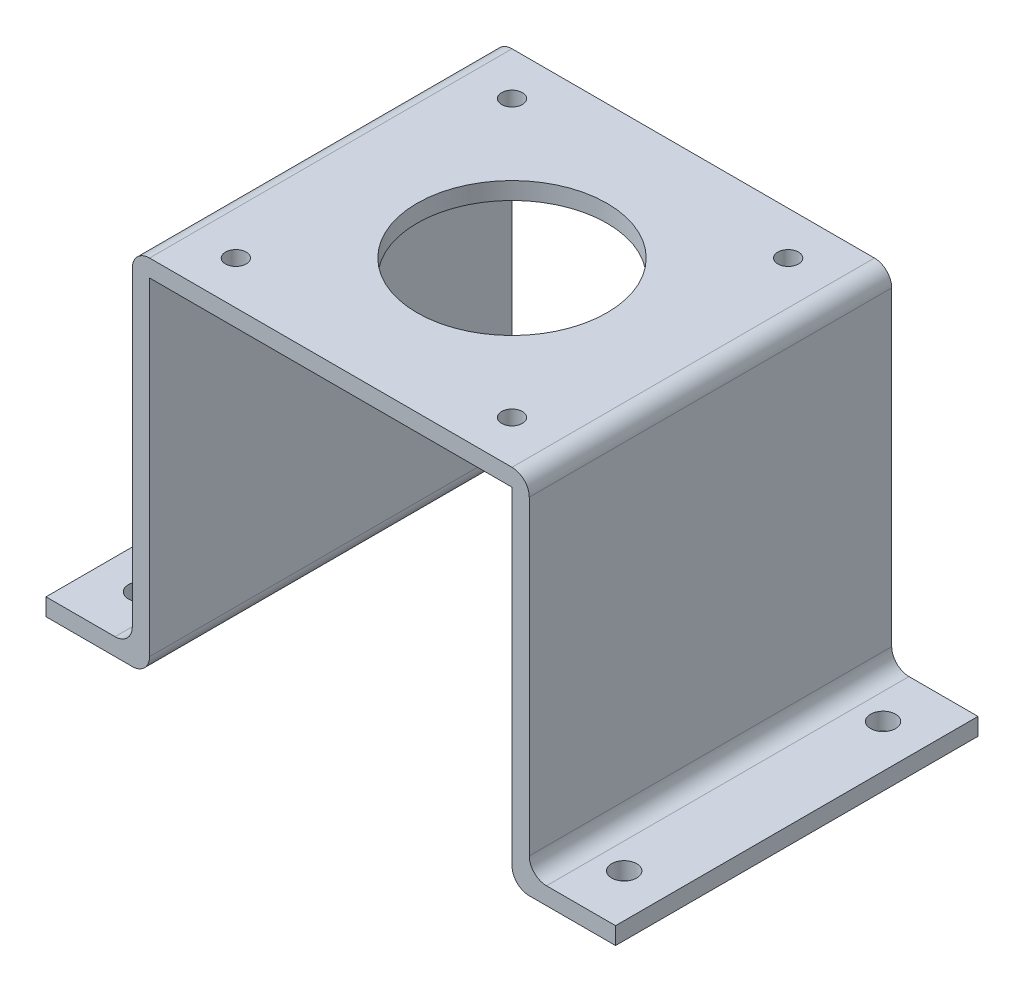
ISO-10303-21;
HEADER;
FILE_DESCRIPTION(('STEP AP214'),'2;1');
FILE_NAME('part.step','',(''),(''),'','','');
FILE_SCHEMA(('AUTOMOTIVE_DESIGN { 1 0 10303 214 1 1 1 1 }'));
ENDSEC;
DATA;
#1=APPLICATION_CONTEXT('core data for automotive mechanical design processes');
#2=APPLICATION_PROTOCOL_DEFINITION('international standard','automotive_design',2000,#1);
#3=PRODUCT_CONTEXT('',#1,'mechanical');
#4=PRODUCT('Part','Part','',(#3));
#5=PRODUCT_RELATED_PRODUCT_CATEGORY('part','',(#4));
#6=PRODUCT_DEFINITION_FORMATION('','',#4);
#7=PRODUCT_DEFINITION_CONTEXT('part definition',#1,'design');
#8=PRODUCT_DEFINITION('design','',#6,#7);
#9=PRODUCT_DEFINITION_SHAPE('','',#8);
#10=(LENGTH_UNIT() NAMED_UNIT(*) SI_UNIT(.MILLI.,.METRE.));
#11=(NAMED_UNIT(*) PLANE_ANGLE_UNIT() SI_UNIT($,.RADIAN.));
#12=(NAMED_UNIT(*) SI_UNIT($,.STERADIAN.) SOLID_ANGLE_UNIT());
#13=UNCERTAINTY_MEASURE_WITH_UNIT(LENGTH_MEASURE(1.E-05),#10,'distance_accuracy_value','');
#14=(GEOMETRIC_REPRESENTATION_CONTEXT(3) GLOBAL_UNCERTAINTY_ASSIGNED_CONTEXT((#13)) GLOBAL_UNIT_ASSIGNED_CONTEXT((#10,
#11,#12)) REPRESENTATION_CONTEXT('',''));
#15=CARTESIAN_POINT('',(0.,0.,0.));
#16=DIRECTION('',(0.,0.,1.));
#17=DIRECTION('',(1.,0.,0.));
#18=AXIS2_PLACEMENT_3D('',#15,#16,#17);
#19=CARTESIAN_POINT('',(66.,2.,42.));
#20=DIRECTION('',(0.,-1.,0.));
#21=DIRECTION('',(1.,0.,0.));
#22=AXIS2_PLACEMENT_3D('',#19,#20,#21);
#23=PLANE('',#22);
#24=CARTESIAN_POINT('',(61.,2.00000000000001,36.));
#25=DIRECTION('',(0.,1.,0.));
#26=DIRECTION('',(0.,0.,1.));
#27=AXIS2_PLACEMENT_3D('',#24,#25,#26);
#28=CIRCLE('',#27,1.45);
#29=CARTESIAN_POINT('',(61.,2.00000000000001,37.45));
#30=VERTEX_POINT('',#29);
#31=EDGE_CURVE('E489',#30,#30,#28,.T.);
#32=ORIENTED_EDGE('',*,*,#31,.F.);
#33=EDGE_LOOP('',(#32));
#34=FACE_BOUND('',#33,.T.);
#35=DIRECTION('',(-1.,0.,0.));
#36=VECTOR('',#35,1.);
#37=CARTESIAN_POINT('',(66.,2.,0.));
#38=LINE('',#37,#36);
#39=CARTESIAN_POINT('',(66.,2.,0.));
#40=VERTEX_POINT('',#39);
#41=CARTESIAN_POINT('',(58.,2.,0.));
#42=VERTEX_POINT('',#41);
#43=EDGE_CURVE('E284',#40,#42,#38,.T.);
#44=ORIENTED_EDGE('',*,*,#43,.T.);
#45=DIRECTION('',(0.,0.,-1.));
#46=VECTOR('',#45,1.);
#47=CARTESIAN_POINT('',(58.,2.,42.));
#48=LINE('',#47,#46);
#49=CARTESIAN_POINT('',(58.,2.,42.));
#50=VERTEX_POINT('',#49);
#51=EDGE_CURVE('E229',#42,#50,#48,.F.);
#52=ORIENTED_EDGE('',*,*,#51,.T.);
#53=DIRECTION('',(-1.,0.,0.));
#54=VECTOR('',#53,1.);
#55=CARTESIAN_POINT('',(66.,2.,42.));
#56=LINE('',#55,#54);
#57=CARTESIAN_POINT('',(66.,2.,42.));
#58=VERTEX_POINT('',#57);
#59=EDGE_CURVE('E323',#58,#50,#56,.T.);
#60=ORIENTED_EDGE('',*,*,#59,.F.);
#61=DIRECTION('',(0.,0.,-1.));
#62=VECTOR('',#61,1.);
#63=CARTESIAN_POINT('',(66.,2.,42.));
#64=LINE('',#63,#62);
#65=EDGE_CURVE('E263',#58,#40,#64,.T.);
#66=ORIENTED_EDGE('',*,*,#65,.T.);
#67=EDGE_LOOP('',(#44,#52,#60,#66));
#68=FACE_BOUND('',#67,.T.);
#69=CARTESIAN_POINT('',(61.,2.00000000000001,6.));
#70=DIRECTION('',(0.,1.,0.));
#71=DIRECTION('',(0.,0.,1.));
#72=AXIS2_PLACEMENT_3D('',#69,#70,#71);
#73=CIRCLE('',#72,1.45);
#74=CARTESIAN_POINT('',(61.,2.00000000000001,7.45));
#75=VERTEX_POINT('',#74);
#76=EDGE_CURVE('E483',#75,#75,#73,.T.);
#77=ORIENTED_EDGE('',*,*,#76,.F.);
#78=EDGE_LOOP('',(#77));
#79=FACE_BOUND('',#78,.T.);
#80=ADVANCED_FACE('F43',(#34,#68,#79),#23,.F.);
#81=CARTESIAN_POINT('',(0.,2.,42.));
#82=DIRECTION('',(1.,0.,0.));
#83=DIRECTION('',(0.,0.,-1.));
#84=AXIS2_PLACEMENT_3D('',#81,#82,#83);
#85=PLANE('',#84);
#86=DIRECTION('',(0.,-1.,0.));
#87=VECTOR('',#86,1.);
#88=CARTESIAN_POINT('',(0.,2.,0.));
#89=LINE('',#88,#87);
#90=CARTESIAN_POINT('',(0.,2.,0.));
#91=VERTEX_POINT('',#90);
#92=CARTESIAN_POINT('',(0.,0.,0.));
#93=VERTEX_POINT('',#92);
#94=EDGE_CURVE('E191',#91,#93,#89,.T.);
#95=ORIENTED_EDGE('',*,*,#94,.T.);
#96=DIRECTION('',(0.,0.,-1.));
#97=VECTOR('',#96,1.);
#98=CARTESIAN_POINT('',(0.,0.,42.));
#99=LINE('',#98,#97);
#100=CARTESIAN_POINT('',(0.,0.,42.));
#101=VERTEX_POINT('',#100);
#102=EDGE_CURVE('E173',#101,#93,#99,.T.);
#103=ORIENTED_EDGE('',*,*,#102,.F.);
#104=DIRECTION('',(0.,-1.,0.));
#105=VECTOR('',#104,1.);
#106=CARTESIAN_POINT('',(0.,2.,42.));
#107=LINE('',#106,#105);
#108=CARTESIAN_POINT('',(0.,2.,42.));
#109=VERTEX_POINT('',#108);
#110=EDGE_CURVE('E179',#109,#101,#107,.T.);
#111=ORIENTED_EDGE('',*,*,#110,.F.);
#112=DIRECTION('',(0.,0.,-1.));
#113=VECTOR('',#112,1.);
#114=CARTESIAN_POINT('',(0.,2.,42.));
#115=LINE('',#114,#113);
#116=EDGE_CURVE('E260',#109,#91,#115,.T.);
#117=ORIENTED_EDGE('',*,*,#116,.T.);
#118=EDGE_LOOP('',(#95,#103,#111,#117));
#119=FACE_BOUND('',#118,.T.);
#120=ADVANCED_FACE('F189',(#119),#85,.F.);
#121=CARTESIAN_POINT('',(0.,0.,42.));
#122=DIRECTION('',(0.,1.,0.));
#123=DIRECTION('',(0.,0.,1.));
#124=AXIS2_PLACEMENT_3D('',#121,#122,#123);
#125=PLANE('',#124);
#126=CARTESIAN_POINT('',(5.,0.,6.));
#127=DIRECTION('',(0.,1.,0.));
#128=DIRECTION('',(0.,0.,1.));
#129=AXIS2_PLACEMENT_3D('',#126,#127,#128);
#130=CIRCLE('',#129,1.45);
#131=CARTESIAN_POINT('',(5.,0.,7.45));
#132=VERTEX_POINT('',#131);
#133=EDGE_CURVE('E474',#132,#132,#130,.T.);
#134=ORIENTED_EDGE('',*,*,#133,.T.);
#135=EDGE_LOOP('',(#134));
#136=FACE_BOUND('',#135,.T.);
#137=CARTESIAN_POINT('',(5.,0.,36.));
#138=DIRECTION('',(0.,1.,0.));
#139=DIRECTION('',(0.,0.,1.));
#140=AXIS2_PLACEMENT_3D('',#137,#138,#139);
#141=CIRCLE('',#140,1.45);
#142=CARTESIAN_POINT('',(5.,0.,37.45));
#143=VERTEX_POINT('',#142);
#144=EDGE_CURVE('E480',#143,#143,#141,.T.);
#145=ORIENTED_EDGE('',*,*,#144,.T.);
#146=EDGE_LOOP('',(#145));
#147=FACE_BOUND('',#146,.T.);
#148=DIRECTION('',(1.,0.,0.));
#149=VECTOR('',#148,1.);
#150=CARTESIAN_POINT('',(0.,0.,0.));
#151=LINE('',#150,#149);
#152=CARTESIAN_POINT('',(10.,0.,0.));
#153=VERTEX_POINT('',#152);
#154=EDGE_CURVE('E270',#93,#153,#151,.T.);
#155=ORIENTED_EDGE('',*,*,#154,.T.);
#156=DIRECTION('',(0.,0.,-1.));
#157=VECTOR('',#156,1.);
#158=CARTESIAN_POINT('',(10.,0.,42.));
#159=LINE('',#158,#157);
#160=CARTESIAN_POINT('',(10.,0.,42.));
#161=VERTEX_POINT('',#160);
#162=EDGE_CURVE('E176',#153,#161,#159,.F.);
#163=ORIENTED_EDGE('',*,*,#162,.T.);
#164=DIRECTION('',(1.,0.,0.));
#165=VECTOR('',#164,1.);
#166=CARTESIAN_POINT('',(0.,0.,42.));
#167=LINE('',#166,#165);
#168=EDGE_CURVE('E168',#101,#161,#167,.T.);
#169=ORIENTED_EDGE('',*,*,#168,.F.);
#170=ORIENTED_EDGE('',*,*,#102,.T.);
#171=EDGE_LOOP('',(#155,#163,#169,#170));
#172=FACE_BOUND('',#171,.T.);
#173=ADVANCED_FACE('F171',(#136,#147,#172),#125,.F.);
#174=CARTESIAN_POINT('',(12.,0.,42.));
#175=DIRECTION('',(-1.,0.,0.));
#176=DIRECTION('',(0.,0.,1.));
#177=AXIS2_PLACEMENT_3D('',#174,#175,#176);
#178=PLANE('',#177);
#179=DIRECTION('',(0.,1.,0.));
#180=VECTOR('',#179,1.);
#181=CARTESIAN_POINT('',(12.,0.,42.));
#182=LINE('',#181,#180);
#183=CARTESIAN_POINT('',(12.,2.,42.));
#184=VERTEX_POINT('',#183);
#185=CARTESIAN_POINT('',(12.,40.,42.));
#186=VERTEX_POINT('',#185);
#187=EDGE_CURVE('E178',#184,#186,#182,.T.);
#188=ORIENTED_EDGE('',*,*,#187,.F.);
#189=DIRECTION('',(0.,0.,-1.));
#190=VECTOR('',#189,1.);
#191=CARTESIAN_POINT('',(12.,2.,42.));
#192=LINE('',#191,#190);
#193=CARTESIAN_POINT('',(12.,2.,0.));
#194=VERTEX_POINT('',#193);
#195=EDGE_CURVE('E192',#184,#194,#192,.T.);
#196=ORIENTED_EDGE('',*,*,#195,.T.);
#197=DIRECTION('',(0.,1.,0.));
#198=VECTOR('',#197,1.);
#199=CARTESIAN_POINT('',(12.,0.,0.));
#200=LINE('',#199,#198);
#201=CARTESIAN_POINT('',(12.,40.,0.));
#202=VERTEX_POINT('',#201);
#203=EDGE_CURVE('E273',#194,#202,#200,.T.);
#204=ORIENTED_EDGE('',*,*,#203,.T.);
#205=DIRECTION('',(0.,0.,-1.));
#206=VECTOR('',#205,1.);
#207=CARTESIAN_POINT('',(12.,40.,42.));
#208=LINE('',#207,#206);
#209=EDGE_CURVE('E193',#186,#202,#208,.T.);
#210=ORIENTED_EDGE('',*,*,#209,.F.);
#211=EDGE_LOOP('',(#188,#196,#204,#210));
#212=FACE_BOUND('',#211,.T.);
#213=ADVANCED_FACE('F498',(#212),#178,.F.);
#214=CARTESIAN_POINT('',(12.,40.,42.));
#215=DIRECTION('',(0.,1.,0.));
#216=DIRECTION('',(0.,0.,1.));
#217=AXIS2_PLACEMENT_3D('',#214,#215,#216);
#218=PLANE('',#217);
#219=CARTESIAN_POINT('',(33.,40.,21.));
#220=DIRECTION('',(0.,1.,0.));
#221=DIRECTION('',(0.,0.,1.));
#222=AXIS2_PLACEMENT_3D('',#219,#220,#221);
#223=CIRCLE('',#222,11.);
#224=CARTESIAN_POINT('',(33.,40.,32.));
#225=VERTEX_POINT('',#224);
#226=EDGE_CURVE('E442',#225,#225,#223,.F.);
#227=ORIENTED_EDGE('',*,*,#226,.F.);
#228=EDGE_LOOP('',(#227));
#229=FACE_BOUND('',#228,.T.);
#230=CARTESIAN_POINT('',(17.,40.,5.00000000000001));
#231=DIRECTION('',(0.,1.,0.));
#232=DIRECTION('',(0.,0.,1.));
#233=AXIS2_PLACEMENT_3D('',#230,#231,#232);
#234=CIRCLE('',#233,1.2);
#235=CARTESIAN_POINT('',(17.,40.,6.2));
#236=VERTEX_POINT('',#235);
#237=EDGE_CURVE('E447',#236,#236,#234,.T.);
#238=ORIENTED_EDGE('',*,*,#237,.T.);
#239=EDGE_LOOP('',(#238));
#240=FACE_BOUND('',#239,.T.);
#241=CARTESIAN_POINT('',(49.,40.,37.));
#242=DIRECTION('',(0.,1.,0.));
#243=DIRECTION('',(0.,0.,1.));
#244=AXIS2_PLACEMENT_3D('',#241,#242,#243);
#245=CIRCLE('',#244,1.2);
#246=CARTESIAN_POINT('',(49.,40.,38.2));
#247=VERTEX_POINT('',#246);
#248=EDGE_CURVE('E456',#247,#247,#245,.T.);
#249=ORIENTED_EDGE('',*,*,#248,.T.);
#250=EDGE_LOOP('',(#249));
#251=FACE_BOUND('',#250,.T.);
#252=CARTESIAN_POINT('',(17.,40.,37.));
#253=DIRECTION('',(0.,1.,0.));
#254=DIRECTION('',(0.,0.,1.));
#255=AXIS2_PLACEMENT_3D('',#252,#253,#254);
#256=CIRCLE('',#255,1.2);
#257=CARTESIAN_POINT('',(17.,40.,38.2));
#258=VERTEX_POINT('',#257);
#259=EDGE_CURVE('E462',#258,#258,#256,.T.);
#260=ORIENTED_EDGE('',*,*,#259,.T.);
#261=EDGE_LOOP('',(#260));
#262=FACE_BOUND('',#261,.T.);
#263=CARTESIAN_POINT('',(49.,40.,5.));
#264=DIRECTION('',(0.,1.,0.));
#265=DIRECTION('',(0.,0.,1.));
#266=AXIS2_PLACEMENT_3D('',#263,#264,#265);
#267=CIRCLE('',#266,1.2);
#268=CARTESIAN_POINT('',(49.,40.,6.2));
#269=VERTEX_POINT('',#268);
#270=EDGE_CURVE('E468',#269,#269,#267,.T.);
#271=ORIENTED_EDGE('',*,*,#270,.T.);
#272=EDGE_LOOP('',(#271));
#273=FACE_BOUND('',#272,.T.);
#274=DIRECTION('',(1.,0.,0.));
#275=VECTOR('',#274,1.);
#276=CARTESIAN_POINT('',(12.,40.,0.));
#277=LINE('',#276,#275);
#278=CARTESIAN_POINT('',(54.,40.,0.));
#279=VERTEX_POINT('',#278);
#280=EDGE_CURVE('E275',#202,#279,#277,.T.);
#281=ORIENTED_EDGE('',*,*,#280,.T.);
#282=DIRECTION('',(0.,0.,-1.));
#283=VECTOR('',#282,1.);
#284=CARTESIAN_POINT('',(54.,40.,42.));
#285=LINE('',#284,#283);
#286=CARTESIAN_POINT('',(54.,40.,42.));
#287=VERTEX_POINT('',#286);
#288=EDGE_CURVE('E199',#287,#279,#285,.T.);
#289=ORIENTED_EDGE('',*,*,#288,.F.);
#290=DIRECTION('',(1.,0.,0.));
#291=VECTOR('',#290,1.);
#292=CARTESIAN_POINT('',(12.,40.,42.));
#293=LINE('',#292,#291);
#294=EDGE_CURVE('E325',#186,#287,#293,.T.);
#295=ORIENTED_EDGE('',*,*,#294,.F.);
#296=ORIENTED_EDGE('',*,*,#209,.T.);
#297=EDGE_LOOP('',(#281,#289,#295,#296));
#298=FACE_BOUND('',#297,.T.);
#299=ADVANCED_FACE('F496',(#229,#240,#251,#262,#273,#298),#218,.F.);
#300=CARTESIAN_POINT('',(54.,40.,42.));
#301=DIRECTION('',(1.,0.,0.));
#302=DIRECTION('',(0.,0.,-1.));
#303=AXIS2_PLACEMENT_3D('',#300,#301,#302);
#304=PLANE('',#303);
#305=DIRECTION('',(0.,-1.,0.));
#306=VECTOR('',#305,1.);
#307=CARTESIAN_POINT('',(54.,40.,0.));
#308=LINE('',#307,#306);
#309=CARTESIAN_POINT('',(54.,2.,0.));
#310=VERTEX_POINT('',#309);
#311=EDGE_CURVE('E277',#279,#310,#308,.T.);
#312=ORIENTED_EDGE('',*,*,#311,.T.);
#313=DIRECTION('',(0.,0.,-1.));
#314=VECTOR('',#313,1.);
#315=CARTESIAN_POINT('',(54.,2.,42.));
#316=LINE('',#315,#314);
#317=CARTESIAN_POINT('',(54.,2.,42.));
#318=VERTEX_POINT('',#317);
#319=EDGE_CURVE('E222',#310,#318,#316,.F.);
#320=ORIENTED_EDGE('',*,*,#319,.T.);
#321=DIRECTION('',(0.,-1.,0.));
#322=VECTOR('',#321,1.);
#323=CARTESIAN_POINT('',(54.,40.,42.));
#324=LINE('',#323,#322);
#325=EDGE_CURVE('E305',#287,#318,#324,.T.);
#326=ORIENTED_EDGE('',*,*,#325,.F.);
#327=ORIENTED_EDGE('',*,*,#288,.T.);
#328=EDGE_LOOP('',(#312,#320,#326,#327));
#329=FACE_BOUND('',#328,.T.);
#330=ADVANCED_FACE('F302',(#329),#304,.F.);
#331=CARTESIAN_POINT('',(54.,0.,42.));
#332=DIRECTION('',(0.,1.,0.));
#333=DIRECTION('',(0.,0.,1.));
#334=AXIS2_PLACEMENT_3D('',#331,#332,#333);
#335=PLANE('',#334);
#336=CARTESIAN_POINT('',(61.,0.,6.));
#337=DIRECTION('',(0.,1.,0.));
#338=DIRECTION('',(0.,0.,1.));
#339=AXIS2_PLACEMENT_3D('',#336,#337,#338);
#340=CIRCLE('',#339,1.45);
#341=CARTESIAN_POINT('',(61.,0.,7.45));
#342=VERTEX_POINT('',#341);
#343=EDGE_CURVE('E486',#342,#342,#340,.T.);
#344=ORIENTED_EDGE('',*,*,#343,.T.);
#345=EDGE_LOOP('',(#344));
#346=FACE_BOUND('',#345,.T.);
#347=CARTESIAN_POINT('',(61.,0.,36.));
#348=DIRECTION('',(0.,1.,0.));
#349=DIRECTION('',(0.,0.,1.));
#350=AXIS2_PLACEMENT_3D('',#347,#348,#349);
#351=CIRCLE('',#350,1.45);
#352=CARTESIAN_POINT('',(61.,0.,37.45));
#353=VERTEX_POINT('',#352);
#354=EDGE_CURVE('E271',#353,#353,#351,.T.);
#355=ORIENTED_EDGE('',*,*,#354,.T.);
#356=EDGE_LOOP('',(#355));
#357=FACE_BOUND('',#356,.T.);
#358=DIRECTION('',(1.,0.,0.));
#359=VECTOR('',#358,1.);
#360=CARTESIAN_POINT('',(54.,0.,42.));
#361=LINE('',#360,#359);
#362=CARTESIAN_POINT('',(56.,0.,42.));
#363=VERTEX_POINT('',#362);
#364=CARTESIAN_POINT('',(66.,0.,42.));
#365=VERTEX_POINT('',#364);
#366=EDGE_CURVE('E319',#363,#365,#361,.T.);
#367=ORIENTED_EDGE('',*,*,#366,.F.);
#368=DIRECTION('',(0.,0.,-1.));
#369=VECTOR('',#368,1.);
#370=CARTESIAN_POINT('',(56.,0.,42.));
#371=LINE('',#370,#369);
#372=CARTESIAN_POINT('',(56.,0.,0.));
#373=VERTEX_POINT('',#372);
#374=EDGE_CURVE('E219',#363,#373,#371,.T.);
#375=ORIENTED_EDGE('',*,*,#374,.T.);
#376=DIRECTION('',(1.,0.,0.));
#377=VECTOR('',#376,1.);
#378=CARTESIAN_POINT('',(54.,0.,0.));
#379=LINE('',#378,#377);
#380=CARTESIAN_POINT('',(66.,0.,0.));
#381=VERTEX_POINT('',#380);
#382=EDGE_CURVE('E280',#373,#381,#379,.T.);
#383=ORIENTED_EDGE('',*,*,#382,.T.);
#384=DIRECTION('',(0.,0.,-1.));
#385=VECTOR('',#384,1.);
#386=CARTESIAN_POINT('',(66.,0.,42.));
#387=LINE('',#386,#385);
#388=EDGE_CURVE('E295',#365,#381,#387,.T.);
#389=ORIENTED_EDGE('',*,*,#388,.F.);
#390=EDGE_LOOP('',(#367,#375,#383,#389));
#391=FACE_BOUND('',#390,.T.);
#392=ADVANCED_FACE('F317',(#346,#357,#391),#335,.F.);
#393=CARTESIAN_POINT('',(66.,0.,42.));
#394=DIRECTION('',(-1.,0.,0.));
#395=DIRECTION('',(0.,0.,1.));
#396=AXIS2_PLACEMENT_3D('',#393,#394,#395);
#397=PLANE('',#396);
#398=DIRECTION('',(0.,1.,0.));
#399=VECTOR('',#398,1.);
#400=CARTESIAN_POINT('',(66.,0.,0.));
#401=LINE('',#400,#399);
#402=EDGE_CURVE('E282',#381,#40,#401,.T.);
#403=ORIENTED_EDGE('',*,*,#402,.T.);
#404=ORIENTED_EDGE('',*,*,#65,.F.);
#405=DIRECTION('',(0.,1.,0.));
#406=VECTOR('',#405,1.);
#407=CARTESIAN_POINT('',(66.,0.,42.));
#408=LINE('',#407,#406);
#409=EDGE_CURVE('E321',#365,#58,#408,.T.);
#410=ORIENTED_EDGE('',*,*,#409,.F.);
#411=ORIENTED_EDGE('',*,*,#388,.T.);
#412=EDGE_LOOP('',(#403,#404,#410,#411));
#413=FACE_BOUND('',#412,.T.);
#414=ADVANCED_FACE('F362',(#413),#397,.F.);
#415=CARTESIAN_POINT('',(56.,2.,42.));
#416=DIRECTION('',(-1.,0.,0.));
#417=DIRECTION('',(0.,0.,1.));
#418=AXIS2_PLACEMENT_3D('',#415,#416,#417);
#419=PLANE('',#418);
#420=DIRECTION('',(0.,1.,0.));
#421=VECTOR('',#420,1.);
#422=CARTESIAN_POINT('',(56.,2.,42.));
#423=LINE('',#422,#421);
#424=CARTESIAN_POINT('',(56.,4.,42.));
#425=VERTEX_POINT('',#424);
#426=CARTESIAN_POINT('',(56.,40.,42.));
#427=VERTEX_POINT('',#426);
#428=EDGE_CURVE('E331',#425,#427,#423,.T.);
#429=ORIENTED_EDGE('',*,*,#428,.F.);
#430=DIRECTION('',(0.,0.,-1.));
#431=VECTOR('',#430,1.);
#432=CARTESIAN_POINT('',(56.,4.,0.));
#433=LINE('',#432,#431);
#434=CARTESIAN_POINT('',(56.,4.,0.));
#435=VERTEX_POINT('',#434);
#436=EDGE_CURVE('E226',#425,#435,#433,.T.);
#437=ORIENTED_EDGE('',*,*,#436,.T.);
#438=DIRECTION('',(0.,1.,0.));
#439=VECTOR('',#438,1.);
#440=CARTESIAN_POINT('',(56.,2.,0.));
#441=LINE('',#440,#439);
#442=CARTESIAN_POINT('',(56.,40.,0.));
#443=VERTEX_POINT('',#442);
#444=EDGE_CURVE('E287',#435,#443,#441,.T.);
#445=ORIENTED_EDGE('',*,*,#444,.T.);
#446=DIRECTION('',(0.,0.,-1.));
#447=VECTOR('',#446,1.);
#448=CARTESIAN_POINT('',(56.,40.,42.));
#449=LINE('',#448,#447);
#450=EDGE_CURVE('E224',#443,#427,#449,.F.);
#451=ORIENTED_EDGE('',*,*,#450,.T.);
#452=EDGE_LOOP('',(#429,#437,#445,#451));
#453=FACE_BOUND('',#452,.T.);
#454=ADVANCED_FACE('F350',(#453),#419,.F.);
#455=CARTESIAN_POINT('',(56.,42.,42.));
#456=DIRECTION('',(0.,-1.,0.));
#457=DIRECTION('',(1.,0.,0.));
#458=AXIS2_PLACEMENT_3D('',#455,#456,#457);
#459=PLANE('',#458);
#460=CARTESIAN_POINT('',(33.,42.,21.));
#461=DIRECTION('',(0.,1.,0.));
#462=DIRECTION('',(0.,0.,1.));
#463=AXIS2_PLACEMENT_3D('',#460,#461,#462);
#464=CIRCLE('',#463,11.);
#465=CARTESIAN_POINT('',(33.,42.,32.));
#466=VERTEX_POINT('',#465);
#467=EDGE_CURVE('E439',#466,#466,#464,.T.);
#468=ORIENTED_EDGE('',*,*,#467,.F.);
#469=EDGE_LOOP('',(#468));
#470=FACE_BOUND('',#469,.T.);
#471=CARTESIAN_POINT('',(17.,42.,5.00000000000001));
#472=DIRECTION('',(0.,1.,0.));
#473=DIRECTION('',(0.,0.,1.));
#474=AXIS2_PLACEMENT_3D('',#471,#472,#473);
#475=CIRCLE('',#474,1.2);
#476=CARTESIAN_POINT('',(17.,42.,6.20000000000001));
#477=VERTEX_POINT('',#476);
#478=EDGE_CURVE('E444',#477,#477,#475,.T.);
#479=ORIENTED_EDGE('',*,*,#478,.F.);
#480=EDGE_LOOP('',(#479));
#481=FACE_BOUND('',#480,.T.);
#482=CARTESIAN_POINT('',(49.,42.,37.));
#483=DIRECTION('',(0.,1.,0.));
#484=DIRECTION('',(0.,0.,1.));
#485=AXIS2_PLACEMENT_3D('',#482,#483,#484);
#486=CIRCLE('',#485,1.2);
#487=CARTESIAN_POINT('',(49.,42.,38.2));
#488=VERTEX_POINT('',#487);
#489=EDGE_CURVE('E453',#488,#488,#486,.T.);
#490=ORIENTED_EDGE('',*,*,#489,.F.);
#491=EDGE_LOOP('',(#490));
#492=FACE_BOUND('',#491,.T.);
#493=CARTESIAN_POINT('',(17.,42.,37.));
#494=DIRECTION('',(0.,1.,0.));
#495=DIRECTION('',(0.,0.,1.));
#496=AXIS2_PLACEMENT_3D('',#493,#494,#495);
#497=CIRCLE('',#496,1.2);
#498=CARTESIAN_POINT('',(17.,42.,38.2));
#499=VERTEX_POINT('',#498);
#500=EDGE_CURVE('E459',#499,#499,#497,.T.);
#501=ORIENTED_EDGE('',*,*,#500,.F.);
#502=EDGE_LOOP('',(#501));
#503=FACE_BOUND('',#502,.T.);
#504=CARTESIAN_POINT('',(49.,42.,5.));
#505=DIRECTION('',(0.,1.,0.));
#506=DIRECTION('',(0.,0.,1.));
#507=AXIS2_PLACEMENT_3D('',#504,#505,#506);
#508=CIRCLE('',#507,1.2);
#509=CARTESIAN_POINT('',(49.,42.,6.2));
#510=VERTEX_POINT('',#509);
#511=EDGE_CURVE('E465',#510,#510,#508,.T.);
#512=ORIENTED_EDGE('',*,*,#511,.F.);
#513=EDGE_LOOP('',(#512));
#514=FACE_BOUND('',#513,.T.);
#515=DIRECTION('',(-1.,0.,0.));
#516=VECTOR('',#515,1.);
#517=CARTESIAN_POINT('',(56.,42.,42.));
#518=LINE('',#517,#516);
#519=CARTESIAN_POINT('',(54.,42.,42.));
#520=VERTEX_POINT('',#519);
#521=CARTESIAN_POINT('',(12.,42.,42.));
#522=VERTEX_POINT('',#521);
#523=EDGE_CURVE('E265',#520,#522,#518,.T.);
#524=ORIENTED_EDGE('',*,*,#523,.F.);
#525=DIRECTION('',(0.,0.,-1.));
#526=VECTOR('',#525,1.);
#527=CARTESIAN_POINT('',(54.,42.,42.));
#528=LINE('',#527,#526);
#529=CARTESIAN_POINT('',(54.,42.,0.));
#530=VERTEX_POINT('',#529);
#531=EDGE_CURVE('E233',#520,#530,#528,.T.);
#532=ORIENTED_EDGE('',*,*,#531,.T.);
#533=DIRECTION('',(-1.,0.,0.));
#534=VECTOR('',#533,1.);
#535=CARTESIAN_POINT('',(56.,42.,0.));
#536=LINE('',#535,#534);
#537=CARTESIAN_POINT('',(12.,42.,0.));
#538=VERTEX_POINT('',#537);
#539=EDGE_CURVE('E256',#530,#538,#536,.T.);
#540=ORIENTED_EDGE('',*,*,#539,.T.);
#541=DIRECTION('',(0.,0.,-1.));
#542=VECTOR('',#541,1.);
#543=CARTESIAN_POINT('',(12.,42.,42.));
#544=LINE('',#543,#542);
#545=EDGE_CURVE('E231',#538,#522,#544,.F.);
#546=ORIENTED_EDGE('',*,*,#545,.T.);
#547=EDGE_LOOP('',(#524,#532,#540,#546));
#548=FACE_BOUND('',#547,.T.);
#549=ADVANCED_FACE('F343',(#470,#481,#492,#503,#514,#548),#459,.F.);
#550=CARTESIAN_POINT('',(9.99999999999999,42.,42.));
#551=DIRECTION('',(1.,0.,0.));
#552=DIRECTION('',(0.,1.,0.));
#553=AXIS2_PLACEMENT_3D('',#550,#551,#552);
#554=PLANE('',#553);
#555=DIRECTION('',(0.,-1.,0.));
#556=VECTOR('',#555,1.);
#557=CARTESIAN_POINT('',(9.99999999999999,42.,42.));
#558=LINE('',#557,#556);
#559=CARTESIAN_POINT('',(9.99999999999999,40.,42.));
#560=VERTEX_POINT('',#559);
#561=CARTESIAN_POINT('',(10.,4.,42.));
#562=VERTEX_POINT('',#561);
#563=EDGE_CURVE('E261',#560,#562,#558,.T.);
#564=ORIENTED_EDGE('',*,*,#563,.F.);
#565=DIRECTION('',(0.,0.,-1.));
#566=VECTOR('',#565,1.);
#567=CARTESIAN_POINT('',(9.99999999999999,40.,42.));
#568=LINE('',#567,#566);
#569=CARTESIAN_POINT('',(9.99999999999999,40.,0.));
#570=VERTEX_POINT('',#569);
#571=EDGE_CURVE('E237',#560,#570,#568,.T.);
#572=ORIENTED_EDGE('',*,*,#571,.T.);
#573=DIRECTION('',(0.,-1.,0.));
#574=VECTOR('',#573,1.);
#575=CARTESIAN_POINT('',(9.99999999999999,42.,0.));
#576=LINE('',#575,#574);
#577=CARTESIAN_POINT('',(10.,4.,0.));
#578=VERTEX_POINT('',#577);
#579=EDGE_CURVE('E251',#570,#578,#576,.T.);
#580=ORIENTED_EDGE('',*,*,#579,.T.);
#581=DIRECTION('',(0.,0.,-1.));
#582=VECTOR('',#581,1.);
#583=CARTESIAN_POINT('',(10.,4.,42.));
#584=LINE('',#583,#582);
#585=EDGE_CURVE('E64',#578,#562,#584,.F.);
#586=ORIENTED_EDGE('',*,*,#585,.T.);
#587=EDGE_LOOP('',(#564,#572,#580,#586));
#588=FACE_BOUND('',#587,.T.);
#589=ADVANCED_FACE('F254',(#588),#554,.F.);
#590=CARTESIAN_POINT('',(10.,2.,42.));
#591=DIRECTION('',(0.,-1.,0.));
#592=DIRECTION('',(1.,0.,0.));
#593=AXIS2_PLACEMENT_3D('',#590,#591,#592);
#594=PLANE('',#593);
#595=CARTESIAN_POINT('',(5.,2.,6.));
#596=DIRECTION('',(0.,1.,0.));
#597=DIRECTION('',(0.,0.,1.));
#598=AXIS2_PLACEMENT_3D('',#595,#596,#597);
#599=CIRCLE('',#598,1.45);
#600=CARTESIAN_POINT('',(5.,2.,7.45));
#601=VERTEX_POINT('',#600);
#602=EDGE_CURVE('E471',#601,#601,#599,.T.);
#603=ORIENTED_EDGE('',*,*,#602,.F.);
#604=EDGE_LOOP('',(#603));
#605=FACE_BOUND('',#604,.T.);
#606=CARTESIAN_POINT('',(5.,2.,36.));
#607=DIRECTION('',(0.,1.,0.));
#608=DIRECTION('',(0.,0.,1.));
#609=AXIS2_PLACEMENT_3D('',#606,#607,#608);
#610=CIRCLE('',#609,1.45);
#611=CARTESIAN_POINT('',(5.,2.,37.45));
#612=VERTEX_POINT('',#611);
#613=EDGE_CURVE('E477',#612,#612,#610,.T.);
#614=ORIENTED_EDGE('',*,*,#613,.F.);
#615=EDGE_LOOP('',(#614));
#616=FACE_BOUND('',#615,.T.);
#617=DIRECTION('',(-1.,0.,0.));
#618=VECTOR('',#617,1.);
#619=CARTESIAN_POINT('',(10.,2.,42.));
#620=LINE('',#619,#618);
#621=CARTESIAN_POINT('',(8.,2.,42.));
#622=VERTEX_POINT('',#621);
#623=EDGE_CURVE('E183',#622,#109,#620,.T.);
#624=ORIENTED_EDGE('',*,*,#623,.F.);
#625=DIRECTION('',(0.,0.,-1.));
#626=VECTOR('',#625,1.);
#627=CARTESIAN_POINT('',(8.,2.,0.));
#628=LINE('',#627,#626);
#629=CARTESIAN_POINT('',(8.,2.,0.));
#630=VERTEX_POINT('',#629);
#631=EDGE_CURVE('E240',#622,#630,#628,.T.);
#632=ORIENTED_EDGE('',*,*,#631,.T.);
#633=DIRECTION('',(-1.,0.,0.));
#634=VECTOR('',#633,1.);
#635=CARTESIAN_POINT('',(10.,2.,0.));
#636=LINE('',#635,#634);
#637=EDGE_CURVE('E187',#630,#91,#636,.T.);
#638=ORIENTED_EDGE('',*,*,#637,.T.);
#639=ORIENTED_EDGE('',*,*,#116,.F.);
#640=EDGE_LOOP('',(#624,#632,#638,#639));
#641=FACE_BOUND('',#640,.T.);
#642=ADVANCED_FACE('F259',(#605,#616,#641),#594,.F.);
#643=CARTESIAN_POINT('',(0.,0.,42.));
#644=DIRECTION('',(0.,0.,1.));
#645=DIRECTION('',(1.,0.,0.));
#646=AXIS2_PLACEMENT_3D('',#643,#644,#645);
#647=PLANE('',#646);
#648=ORIENTED_EDGE('',*,*,#168,.T.);
#649=CARTESIAN_POINT('',(10.,2.,42.));
#650=DIRECTION('',(0.,0.,1.));
#651=DIRECTION('',(1.,0.,0.));
#652=AXIS2_PLACEMENT_3D('',#649,#650,#651);
#653=CIRCLE('',#652,2.);
#654=EDGE_CURVE('E217',#161,#184,#653,.T.);
#655=ORIENTED_EDGE('',*,*,#654,.T.);
#656=ORIENTED_EDGE('',*,*,#187,.T.);
#657=ORIENTED_EDGE('',*,*,#294,.T.);
#658=ORIENTED_EDGE('',*,*,#325,.T.);
#659=CARTESIAN_POINT('',(56.,2.,42.));
#660=DIRECTION('',(0.,0.,1.));
#661=DIRECTION('',(1.,0.,0.));
#662=AXIS2_PLACEMENT_3D('',#659,#660,#661);
#663=CIRCLE('',#662,2.);
#664=EDGE_CURVE('E215',#318,#363,#663,.T.);
#665=ORIENTED_EDGE('',*,*,#664,.T.);
#666=ORIENTED_EDGE('',*,*,#366,.T.);
#667=ORIENTED_EDGE('',*,*,#409,.T.);
#668=ORIENTED_EDGE('',*,*,#59,.T.);
#669=CARTESIAN_POINT('',(58.,4.,42.));
#670=DIRECTION('',(0.,0.,1.));
#671=DIRECTION('',(1.,0.,0.));
#672=AXIS2_PLACEMENT_3D('',#669,#670,#671);
#673=CIRCLE('',#672,2.);
#674=EDGE_CURVE('E245',#50,#425,#673,.F.);
#675=ORIENTED_EDGE('',*,*,#674,.T.);
#676=ORIENTED_EDGE('',*,*,#428,.T.);
#677=CARTESIAN_POINT('',(54.,40.,42.));
#678=DIRECTION('',(0.,0.,1.));
#679=DIRECTION('',(1.,0.,0.));
#680=AXIS2_PLACEMENT_3D('',#677,#678,#679);
#681=CIRCLE('',#680,2.);
#682=EDGE_CURVE('E213',#427,#520,#681,.T.);
#683=ORIENTED_EDGE('',*,*,#682,.T.);
#684=ORIENTED_EDGE('',*,*,#523,.T.);
#685=CARTESIAN_POINT('',(12.,40.,42.));
#686=DIRECTION('',(0.,0.,1.));
#687=DIRECTION('',(1.,0.,0.));
#688=AXIS2_PLACEMENT_3D('',#685,#686,#687);
#689=CIRCLE('',#688,2.);
#690=EDGE_CURVE('E211',#522,#560,#689,.T.);
#691=ORIENTED_EDGE('',*,*,#690,.T.);
#692=ORIENTED_EDGE('',*,*,#563,.T.);
#693=CARTESIAN_POINT('',(8.,4.,42.));
#694=DIRECTION('',(0.,0.,1.));
#695=DIRECTION('',(1.,0.,0.));
#696=AXIS2_PLACEMENT_3D('',#693,#694,#695);
#697=CIRCLE('',#696,2.);
#698=EDGE_CURVE('E11',#562,#622,#697,.F.);
#699=ORIENTED_EDGE('',*,*,#698,.T.);
#700=ORIENTED_EDGE('',*,*,#623,.T.);
#701=ORIENTED_EDGE('',*,*,#110,.T.);
#702=EDGE_LOOP('',(#648,#655,#656,#657,#658,#665,#666,#667,#668,#675,#676,#683,#684,#691,#692,
#699,#700,#701));
#703=FACE_BOUND('',#702,.T.);
#704=ADVANCED_FACE('F182',(#703),#647,.T.);
#705=CARTESIAN_POINT('',(0.,0.,0.));
#706=DIRECTION('',(0.,0.,1.));
#707=DIRECTION('',(1.,0.,0.));
#708=AXIS2_PLACEMENT_3D('',#705,#706,#707);
#709=PLANE('',#708);
#710=ORIENTED_EDGE('',*,*,#203,.F.);
#711=CARTESIAN_POINT('',(10.,2.,0.));
#712=DIRECTION('',(0.,0.,1.));
#713=DIRECTION('',(1.,0.,0.));
#714=AXIS2_PLACEMENT_3D('',#711,#712,#713);
#715=CIRCLE('',#714,2.);
#716=EDGE_CURVE('E208',#194,#153,#715,.F.);
#717=ORIENTED_EDGE('',*,*,#716,.T.);
#718=ORIENTED_EDGE('',*,*,#154,.F.);
#719=ORIENTED_EDGE('',*,*,#94,.F.);
#720=ORIENTED_EDGE('',*,*,#637,.F.);
#721=CARTESIAN_POINT('',(8.,4.,0.));
#722=DIRECTION('',(0.,0.,1.));
#723=DIRECTION('',(1.,0.,0.));
#724=AXIS2_PLACEMENT_3D('',#721,#722,#723);
#725=CIRCLE('',#724,2.);
#726=EDGE_CURVE('E51',#630,#578,#725,.T.);
#727=ORIENTED_EDGE('',*,*,#726,.T.);
#728=ORIENTED_EDGE('',*,*,#579,.F.);
#729=CARTESIAN_POINT('',(12.,40.,0.));
#730=DIRECTION('',(0.,0.,1.));
#731=DIRECTION('',(1.,0.,0.));
#732=AXIS2_PLACEMENT_3D('',#729,#730,#731);
#733=CIRCLE('',#732,2.);
#734=EDGE_CURVE('E196',#570,#538,#733,.F.);
#735=ORIENTED_EDGE('',*,*,#734,.T.);
#736=ORIENTED_EDGE('',*,*,#539,.F.);
#737=CARTESIAN_POINT('',(54.,40.,0.));
#738=DIRECTION('',(0.,0.,1.));
#739=DIRECTION('',(1.,0.,0.));
#740=AXIS2_PLACEMENT_3D('',#737,#738,#739);
#741=CIRCLE('',#740,2.);
#742=EDGE_CURVE('E204',#530,#443,#741,.F.);
#743=ORIENTED_EDGE('',*,*,#742,.T.);
#744=ORIENTED_EDGE('',*,*,#444,.F.);
#745=CARTESIAN_POINT('',(58.,4.,0.));
#746=DIRECTION('',(0.,0.,1.));
#747=DIRECTION('',(1.,0.,0.));
#748=AXIS2_PLACEMENT_3D('',#745,#746,#747);
#749=CIRCLE('',#748,2.);
#750=EDGE_CURVE('E243',#435,#42,#749,.T.);
#751=ORIENTED_EDGE('',*,*,#750,.T.);
#752=ORIENTED_EDGE('',*,*,#43,.F.);
#753=ORIENTED_EDGE('',*,*,#402,.F.);
#754=ORIENTED_EDGE('',*,*,#382,.F.);
#755=CARTESIAN_POINT('',(56.,2.,0.));
#756=DIRECTION('',(0.,0.,1.));
#757=DIRECTION('',(1.,0.,0.));
#758=AXIS2_PLACEMENT_3D('',#755,#756,#757);
#759=CIRCLE('',#758,2.);
#760=EDGE_CURVE('E206',#373,#310,#759,.F.);
#761=ORIENTED_EDGE('',*,*,#760,.T.);
#762=ORIENTED_EDGE('',*,*,#311,.F.);
#763=ORIENTED_EDGE('',*,*,#280,.F.);
#764=EDGE_LOOP('',(#710,#717,#718,#719,#720,#727,#728,#735,#736,#743,#744,#751,#752,#753,#754,
#761,#762,#763));
#765=FACE_BOUND('',#764,.T.);
#766=ADVANCED_FACE('F250',(#765),#709,.F.);
#767=CARTESIAN_POINT('',(61.,2.00000000000001,36.));
#768=DIRECTION('',(0.,1.,0.));
#769=DIRECTION('',(0.,0.,1.));
#770=AXIS2_PLACEMENT_3D('',#767,#768,#769);
#771=CYLINDRICAL_SURFACE('',#770,1.45);
#772=ORIENTED_EDGE('',*,*,#354,.F.);
#773=EDGE_LOOP('',(#772));
#774=FACE_BOUND('',#773,.T.);
#775=ORIENTED_EDGE('',*,*,#31,.T.);
#776=EDGE_LOOP('',(#775));
#777=FACE_BOUND('',#776,.T.);
#778=ADVANCED_FACE('F394',(#774,#777),#771,.F.);
#779=CARTESIAN_POINT('',(61.,2.00000000000001,6.));
#780=DIRECTION('',(0.,1.,0.));
#781=DIRECTION('',(0.,0.,1.));
#782=AXIS2_PLACEMENT_3D('',#779,#780,#781);
#783=CYLINDRICAL_SURFACE('',#782,1.45);
#784=ORIENTED_EDGE('',*,*,#343,.F.);
#785=EDGE_LOOP('',(#784));
#786=FACE_BOUND('',#785,.T.);
#787=ORIENTED_EDGE('',*,*,#76,.T.);
#788=EDGE_LOOP('',(#787));
#789=FACE_BOUND('',#788,.T.);
#790=ADVANCED_FACE('F398',(#786,#789),#783,.F.);
#791=CARTESIAN_POINT('',(5.,2.,36.));
#792=DIRECTION('',(0.,1.,0.));
#793=DIRECTION('',(0.,0.,1.));
#794=AXIS2_PLACEMENT_3D('',#791,#792,#793);
#795=CYLINDRICAL_SURFACE('',#794,1.45);
#796=ORIENTED_EDGE('',*,*,#144,.F.);
#797=EDGE_LOOP('',(#796));
#798=FACE_BOUND('',#797,.T.);
#799=ORIENTED_EDGE('',*,*,#613,.T.);
#800=EDGE_LOOP('',(#799));
#801=FACE_BOUND('',#800,.T.);
#802=ADVANCED_FACE('F402',(#798,#801),#795,.F.);
#803=CARTESIAN_POINT('',(5.,2.,6.));
#804=DIRECTION('',(0.,1.,0.));
#805=DIRECTION('',(0.,0.,1.));
#806=AXIS2_PLACEMENT_3D('',#803,#804,#805);
#807=CYLINDRICAL_SURFACE('',#806,1.45);
#808=ORIENTED_EDGE('',*,*,#133,.F.);
#809=EDGE_LOOP('',(#808));
#810=FACE_BOUND('',#809,.T.);
#811=ORIENTED_EDGE('',*,*,#602,.T.);
#812=EDGE_LOOP('',(#811));
#813=FACE_BOUND('',#812,.T.);
#814=ADVANCED_FACE('F406',(#810,#813),#807,.F.);
#815=CARTESIAN_POINT('',(49.,42.,5.));
#816=DIRECTION('',(0.,1.,0.));
#817=DIRECTION('',(0.,0.,1.));
#818=AXIS2_PLACEMENT_3D('',#815,#816,#817);
#819=CYLINDRICAL_SURFACE('',#818,1.2);
#820=ORIENTED_EDGE('',*,*,#511,.T.);
#821=EDGE_LOOP('',(#820));
#822=FACE_BOUND('',#821,.T.);
#823=ORIENTED_EDGE('',*,*,#270,.F.);
#824=EDGE_LOOP('',(#823));
#825=FACE_BOUND('',#824,.T.);
#826=ADVANCED_FACE('F410',(#822,#825),#819,.F.);
#827=CARTESIAN_POINT('',(17.,42.,37.));
#828=DIRECTION('',(0.,1.,0.));
#829=DIRECTION('',(0.,0.,1.));
#830=AXIS2_PLACEMENT_3D('',#827,#828,#829);
#831=CYLINDRICAL_SURFACE('',#830,1.2);
#832=ORIENTED_EDGE('',*,*,#500,.T.);
#833=EDGE_LOOP('',(#832));
#834=FACE_BOUND('',#833,.T.);
#835=ORIENTED_EDGE('',*,*,#259,.F.);
#836=EDGE_LOOP('',(#835));
#837=FACE_BOUND('',#836,.T.);
#838=ADVANCED_FACE('F414',(#834,#837),#831,.F.);
#839=CARTESIAN_POINT('',(49.,42.,37.));
#840=DIRECTION('',(0.,1.,0.));
#841=DIRECTION('',(0.,0.,1.));
#842=AXIS2_PLACEMENT_3D('',#839,#840,#841);
#843=CYLINDRICAL_SURFACE('',#842,1.2);
#844=ORIENTED_EDGE('',*,*,#489,.T.);
#845=EDGE_LOOP('',(#844));
#846=FACE_BOUND('',#845,.T.);
#847=ORIENTED_EDGE('',*,*,#248,.F.);
#848=EDGE_LOOP('',(#847));
#849=FACE_BOUND('',#848,.T.);
#850=ADVANCED_FACE('F418',(#846,#849),#843,.F.);
#851=CARTESIAN_POINT('',(17.,42.,5.00000000000001));
#852=DIRECTION('',(0.,1.,0.));
#853=DIRECTION('',(0.,0.,1.));
#854=AXIS2_PLACEMENT_3D('',#851,#852,#853);
#855=CYLINDRICAL_SURFACE('',#854,1.2);
#856=ORIENTED_EDGE('',*,*,#478,.T.);
#857=EDGE_LOOP('',(#856));
#858=FACE_BOUND('',#857,.T.);
#859=ORIENTED_EDGE('',*,*,#237,.F.);
#860=EDGE_LOOP('',(#859));
#861=FACE_BOUND('',#860,.T.);
#862=ADVANCED_FACE('F422',(#858,#861),#855,.F.);
#863=CARTESIAN_POINT('',(33.,-0.001000000000001,21.));
#864=DIRECTION('',(0.,1.,0.));
#865=DIRECTION('',(0.,0.,1.));
#866=AXIS2_PLACEMENT_3D('',#863,#864,#865);
#867=CYLINDRICAL_SURFACE('',#866,11.);
#868=ORIENTED_EDGE('',*,*,#467,.T.);
#869=EDGE_LOOP('',(#868));
#870=FACE_BOUND('',#869,.T.);
#871=ORIENTED_EDGE('',*,*,#226,.T.);
#872=EDGE_LOOP('',(#871));
#873=FACE_BOUND('',#872,.T.);
#874=ADVANCED_FACE('F426',(#870,#873),#867,.F.);
#875=CARTESIAN_POINT('',(10.,2.,42.));
#876=DIRECTION('',(0.,0.,-1.));
#877=DIRECTION('',(-1.,0.,0.));
#878=AXIS2_PLACEMENT_3D('',#875,#876,#877);
#879=CYLINDRICAL_SURFACE('',#878,2.);
#880=ORIENTED_EDGE('',*,*,#654,.F.);
#881=ORIENTED_EDGE('',*,*,#162,.F.);
#882=ORIENTED_EDGE('',*,*,#716,.F.);
#883=ORIENTED_EDGE('',*,*,#195,.F.);
#884=EDGE_LOOP('',(#880,#881,#882,#883));
#885=FACE_BOUND('',#884,.T.);
#886=ADVANCED_FACE('F428',(#885),#879,.T.);
#887=CARTESIAN_POINT('',(56.,2.,42.));
#888=DIRECTION('',(0.,0.,-1.));
#889=DIRECTION('',(-1.,0.,0.));
#890=AXIS2_PLACEMENT_3D('',#887,#888,#889);
#891=CYLINDRICAL_SURFACE('',#890,2.);
#892=ORIENTED_EDGE('',*,*,#664,.F.);
#893=ORIENTED_EDGE('',*,*,#319,.F.);
#894=ORIENTED_EDGE('',*,*,#760,.F.);
#895=ORIENTED_EDGE('',*,*,#374,.F.);
#896=EDGE_LOOP('',(#892,#893,#894,#895));
#897=FACE_BOUND('',#896,.T.);
#898=ADVANCED_FACE('F314',(#897),#891,.T.);
#899=CARTESIAN_POINT('',(58.,4.,42.));
#900=DIRECTION('',(0.,0.,1.));
#901=DIRECTION('',(1.,0.,0.));
#902=AXIS2_PLACEMENT_3D('',#899,#900,#901);
#903=CYLINDRICAL_SURFACE('',#902,2.);
#904=ORIENTED_EDGE('',*,*,#674,.F.);
#905=ORIENTED_EDGE('',*,*,#51,.F.);
#906=ORIENTED_EDGE('',*,*,#750,.F.);
#907=ORIENTED_EDGE('',*,*,#436,.F.);
#908=EDGE_LOOP('',(#904,#905,#906,#907));
#909=FACE_BOUND('',#908,.T.);
#910=ADVANCED_FACE('F354',(#909),#903,.F.);
#911=CARTESIAN_POINT('',(54.,40.,42.));
#912=DIRECTION('',(0.,0.,-1.));
#913=DIRECTION('',(-1.,0.,0.));
#914=AXIS2_PLACEMENT_3D('',#911,#912,#913);
#915=CYLINDRICAL_SURFACE('',#914,2.);
#916=ORIENTED_EDGE('',*,*,#682,.F.);
#917=ORIENTED_EDGE('',*,*,#450,.F.);
#918=ORIENTED_EDGE('',*,*,#742,.F.);
#919=ORIENTED_EDGE('',*,*,#531,.F.);
#920=EDGE_LOOP('',(#916,#917,#918,#919));
#921=FACE_BOUND('',#920,.T.);
#922=ADVANCED_FACE('F345',(#921),#915,.T.);
#923=CARTESIAN_POINT('',(12.,40.,42.));
#924=DIRECTION('',(0.,0.,-1.));
#925=DIRECTION('',(-1.,0.,0.));
#926=AXIS2_PLACEMENT_3D('',#923,#924,#925);
#927=CYLINDRICAL_SURFACE('',#926,2.);
#928=ORIENTED_EDGE('',*,*,#690,.F.);
#929=ORIENTED_EDGE('',*,*,#545,.F.);
#930=ORIENTED_EDGE('',*,*,#734,.F.);
#931=ORIENTED_EDGE('',*,*,#571,.F.);
#932=EDGE_LOOP('',(#928,#929,#930,#931));
#933=FACE_BOUND('',#932,.T.);
#934=ADVANCED_FACE('F341',(#933),#927,.T.);
#935=CARTESIAN_POINT('',(8.,4.,42.));
#936=DIRECTION('',(0.,0.,1.));
#937=DIRECTION('',(1.,0.,0.));
#938=AXIS2_PLACEMENT_3D('',#935,#936,#937);
#939=CYLINDRICAL_SURFACE('',#938,2.);
#940=ORIENTED_EDGE('',*,*,#698,.F.);
#941=ORIENTED_EDGE('',*,*,#585,.F.);
#942=ORIENTED_EDGE('',*,*,#726,.F.);
#943=ORIENTED_EDGE('',*,*,#631,.F.);
#944=EDGE_LOOP('',(#940,#941,#942,#943));
#945=FACE_BOUND('',#944,.T.);
#946=ADVANCED_FACE('F45',(#945),#939,.F.);
#947=CLOSED_SHELL('',(#80,#120,#173,#213,#299,#330,#392,#414,#454,#549,#589,#642,#704,#766,#778,
#790,#802,#814,#826,#838,#850,#862,#874,#886,#898,#910,#922,#934,#946));
#948=MANIFOLD_SOLID_BREP('B2',#947);
#949=ADVANCED_BREP_SHAPE_REPRESENTATION('',(#18,#948),#14);
#950=SHAPE_DEFINITION_REPRESENTATION(#9,#949);
ENDSEC;
END-ISO-10303-21;
